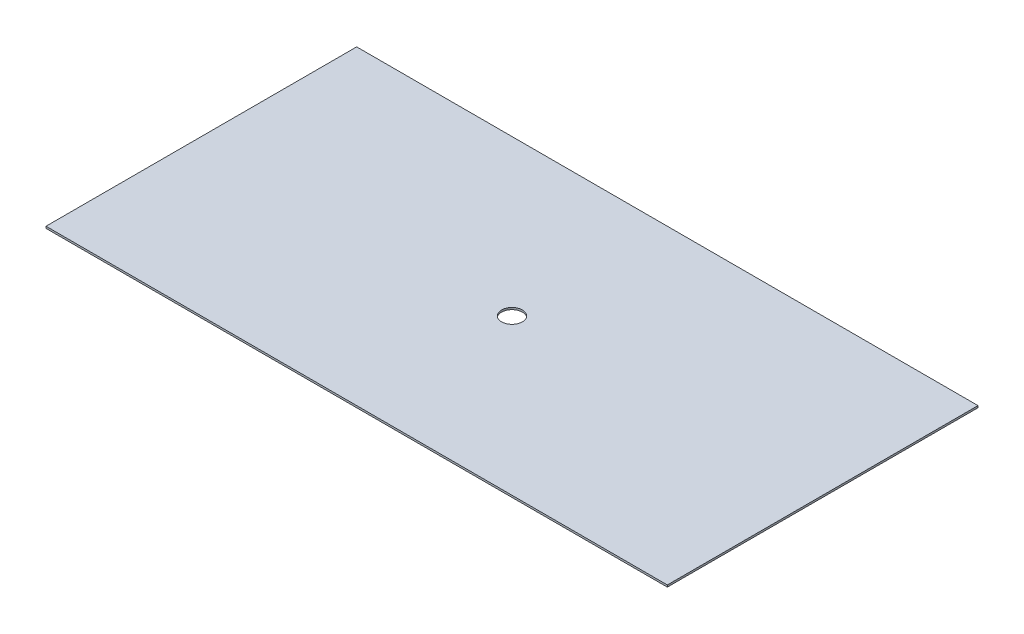
ISO-10303-21;
HEADER;
FILE_DESCRIPTION(('STEP AP214'),'2;1');
FILE_NAME('part.step','',(''),(''),'','','');
FILE_SCHEMA(('AUTOMOTIVE_DESIGN { 1 0 10303 214 1 1 1 1 }'));
ENDSEC;
DATA;
#1=APPLICATION_CONTEXT('core data for automotive mechanical design processes');
#2=APPLICATION_PROTOCOL_DEFINITION('international standard','automotive_design',2000,#1);
#3=PRODUCT_CONTEXT('',#1,'mechanical');
#4=PRODUCT('Part','Part','',(#3));
#5=PRODUCT_RELATED_PRODUCT_CATEGORY('part','',(#4));
#6=PRODUCT_DEFINITION_FORMATION('','',#4);
#7=PRODUCT_DEFINITION_CONTEXT('part definition',#1,'design');
#8=PRODUCT_DEFINITION('design','',#6,#7);
#9=PRODUCT_DEFINITION_SHAPE('','',#8);
#10=(LENGTH_UNIT() NAMED_UNIT(*) SI_UNIT(.MILLI.,.METRE.));
#11=(NAMED_UNIT(*) PLANE_ANGLE_UNIT() SI_UNIT($,.RADIAN.));
#12=(NAMED_UNIT(*) SI_UNIT($,.STERADIAN.) SOLID_ANGLE_UNIT());
#13=UNCERTAINTY_MEASURE_WITH_UNIT(LENGTH_MEASURE(1.E-05),#10,'distance_accuracy_value','');
#14=(GEOMETRIC_REPRESENTATION_CONTEXT(3) GLOBAL_UNCERTAINTY_ASSIGNED_CONTEXT((#13)) GLOBAL_UNIT_ASSIGNED_CONTEXT((#10,
#11,#12)) REPRESENTATION_CONTEXT('',''));
#15=CARTESIAN_POINT('',(0.,0.,0.));
#16=DIRECTION('',(0.,0.,1.));
#17=DIRECTION('',(1.,0.,0.));
#18=AXIS2_PLACEMENT_3D('',#15,#16,#17);
#19=CARTESIAN_POINT('',(-120.,-0.7366,-60.));
#20=DIRECTION('',(-1.,0.,0.));
#21=DIRECTION('',(0.,0.,1.));
#22=AXIS2_PLACEMENT_3D('',#19,#20,#21);
#23=PLANE('',#22);
#24=DIRECTION('',(0.,0.,1.));
#25=VECTOR('',#24,1.);
#26=CARTESIAN_POINT('',(-120.,0.,-60.));
#27=LINE('',#26,#25);
#28=CARTESIAN_POINT('',(-120.,0.,-60.));
#29=VERTEX_POINT('',#28);
#30=CARTESIAN_POINT('',(-120.,0.,60.));
#31=VERTEX_POINT('',#30);
#32=EDGE_CURVE('E100',#29,#31,#27,.T.);
#33=ORIENTED_EDGE('',*,*,#32,.F.);
#34=DIRECTION('',(0.,1.,0.));
#35=VECTOR('',#34,1.);
#36=CARTESIAN_POINT('',(-120.,-0.7366,-60.));
#37=LINE('',#36,#35);
#38=CARTESIAN_POINT('',(-120.,-0.7366,-60.));
#39=VERTEX_POINT('',#38);
#40=EDGE_CURVE('E11',#39,#29,#37,.T.);
#41=ORIENTED_EDGE('',*,*,#40,.F.);
#42=DIRECTION('',(0.,0.,1.));
#43=VECTOR('',#42,1.);
#44=CARTESIAN_POINT('',(-120.,-0.7366,-60.));
#45=LINE('',#44,#43);
#46=CARTESIAN_POINT('',(-120.,-0.7366,60.));
#47=VERTEX_POINT('',#46);
#48=EDGE_CURVE('E93',#39,#47,#45,.T.);
#49=ORIENTED_EDGE('',*,*,#48,.T.);
#50=DIRECTION('',(0.,1.,0.));
#51=VECTOR('',#50,1.);
#52=CARTESIAN_POINT('',(-120.,-0.7366,60.));
#53=LINE('',#52,#51);
#54=EDGE_CURVE('E38',#47,#31,#53,.T.);
#55=ORIENTED_EDGE('',*,*,#54,.T.);
#56=EDGE_LOOP('',(#33,#41,#49,#55));
#57=FACE_BOUND('',#56,.T.);
#58=ADVANCED_FACE('F35',(#57),#23,.T.);
#59=CARTESIAN_POINT('',(-120.,-0.7366,-60.));
#60=DIRECTION('',(0.,0.,-1.));
#61=DIRECTION('',(-1.,0.,0.));
#62=AXIS2_PLACEMENT_3D('',#59,#60,#61);
#63=PLANE('',#62);
#64=DIRECTION('',(-1.,0.,0.));
#65=VECTOR('',#64,1.);
#66=CARTESIAN_POINT('',(-120.,0.,-60.));
#67=LINE('',#66,#65);
#68=CARTESIAN_POINT('',(120.,0.,-60.));
#69=VERTEX_POINT('',#68);
#70=EDGE_CURVE('E95',#69,#29,#67,.T.);
#71=ORIENTED_EDGE('',*,*,#70,.F.);
#72=DIRECTION('',(0.,1.,0.));
#73=VECTOR('',#72,1.);
#74=CARTESIAN_POINT('',(120.,-0.7366,-60.));
#75=LINE('',#74,#73);
#76=CARTESIAN_POINT('',(120.,-0.7366,-60.));
#77=VERTEX_POINT('',#76);
#78=EDGE_CURVE('E44',#77,#69,#75,.T.);
#79=ORIENTED_EDGE('',*,*,#78,.F.);
#80=DIRECTION('',(-1.,0.,0.));
#81=VECTOR('',#80,1.);
#82=CARTESIAN_POINT('',(-120.,-0.7366,-60.));
#83=LINE('',#82,#81);
#84=EDGE_CURVE('E90',#77,#39,#83,.T.);
#85=ORIENTED_EDGE('',*,*,#84,.T.);
#86=ORIENTED_EDGE('',*,*,#40,.T.);
#87=EDGE_LOOP('',(#71,#79,#85,#86));
#88=FACE_BOUND('',#87,.T.);
#89=ADVANCED_FACE('F111',(#88),#63,.T.);
#90=CARTESIAN_POINT('',(120.,-0.7366,-60.));
#91=DIRECTION('',(1.,0.,0.));
#92=DIRECTION('',(0.,0.,-1.));
#93=AXIS2_PLACEMENT_3D('',#90,#91,#92);
#94=PLANE('',#93);
#95=DIRECTION('',(0.,0.,-1.));
#96=VECTOR('',#95,1.);
#97=CARTESIAN_POINT('',(120.,0.,-60.));
#98=LINE('',#97,#96);
#99=CARTESIAN_POINT('',(120.,0.,60.));
#100=VERTEX_POINT('',#99);
#101=EDGE_CURVE('E85',#100,#69,#98,.T.);
#102=ORIENTED_EDGE('',*,*,#101,.F.);
#103=DIRECTION('',(0.,1.,0.));
#104=VECTOR('',#103,1.);
#105=CARTESIAN_POINT('',(120.,-0.7366,60.));
#106=LINE('',#105,#104);
#107=CARTESIAN_POINT('',(120.,-0.7366,60.));
#108=VERTEX_POINT('',#107);
#109=EDGE_CURVE('E80',#108,#100,#106,.T.);
#110=ORIENTED_EDGE('',*,*,#109,.F.);
#111=DIRECTION('',(0.,0.,-1.));
#112=VECTOR('',#111,1.);
#113=CARTESIAN_POINT('',(120.,-0.7366,-60.));
#114=LINE('',#113,#112);
#115=EDGE_CURVE('E83',#108,#77,#114,.T.);
#116=ORIENTED_EDGE('',*,*,#115,.T.);
#117=ORIENTED_EDGE('',*,*,#78,.T.);
#118=EDGE_LOOP('',(#102,#110,#116,#117));
#119=FACE_BOUND('',#118,.T.);
#120=ADVANCED_FACE('F82',(#119),#94,.T.);
#121=CARTESIAN_POINT('',(-120.,-0.7366,60.));
#122=DIRECTION('',(0.,0.,1.));
#123=DIRECTION('',(1.,0.,0.));
#124=AXIS2_PLACEMENT_3D('',#121,#122,#123);
#125=PLANE('',#124);
#126=DIRECTION('',(1.,0.,0.));
#127=VECTOR('',#126,1.);
#128=CARTESIAN_POINT('',(-120.,0.,60.));
#129=LINE('',#128,#127);
#130=EDGE_CURVE('E103',#31,#100,#129,.T.);
#131=ORIENTED_EDGE('',*,*,#130,.F.);
#132=ORIENTED_EDGE('',*,*,#54,.F.);
#133=DIRECTION('',(1.,0.,0.));
#134=VECTOR('',#133,1.);
#135=CARTESIAN_POINT('',(-120.,-0.7366,60.));
#136=LINE('',#135,#134);
#137=EDGE_CURVE('E89',#47,#108,#136,.T.);
#138=ORIENTED_EDGE('',*,*,#137,.T.);
#139=ORIENTED_EDGE('',*,*,#109,.T.);
#140=EDGE_LOOP('',(#131,#132,#138,#139));
#141=FACE_BOUND('',#140,.T.);
#142=ADVANCED_FACE('F92',(#141),#125,.T.);
#143=CARTESIAN_POINT('',(0.,-0.7366,0.));
#144=DIRECTION('',(0.,1.,0.));
#145=DIRECTION('',(0.,0.,1.));
#146=AXIS2_PLACEMENT_3D('',#143,#144,#145);
#147=PLANE('',#146);
#148=CARTESIAN_POINT('',(0.,-0.7366,0.));
#149=DIRECTION('',(0.,1.,0.));
#150=DIRECTION('',(0.,0.,1.));
#151=AXIS2_PLACEMENT_3D('',#148,#149,#150);
#152=CIRCLE('',#151,4.);
#153=CARTESIAN_POINT('',(0.,-0.7366,4.));
#154=VERTEX_POINT('',#153);
#155=EDGE_CURVE('E104',#154,#154,#152,.T.);
#156=ORIENTED_EDGE('',*,*,#155,.T.);
#157=EDGE_LOOP('',(#156));
#158=FACE_BOUND('',#157,.T.);
#159=ORIENTED_EDGE('',*,*,#48,.F.);
#160=ORIENTED_EDGE('',*,*,#84,.F.);
#161=ORIENTED_EDGE('',*,*,#115,.F.);
#162=ORIENTED_EDGE('',*,*,#137,.F.);
#163=EDGE_LOOP('',(#159,#160,#161,#162));
#164=FACE_BOUND('',#163,.T.);
#165=ADVANCED_FACE('F88',(#158,#164),#147,.F.);
#166=CARTESIAN_POINT('',(0.,0.,0.));
#167=DIRECTION('',(0.,1.,0.));
#168=DIRECTION('',(0.,0.,1.));
#169=AXIS2_PLACEMENT_3D('',#166,#167,#168);
#170=PLANE('',#169);
#171=CARTESIAN_POINT('',(0.,0.,0.));
#172=DIRECTION('',(0.,1.,0.));
#173=DIRECTION('',(0.,0.,1.));
#174=AXIS2_PLACEMENT_3D('',#171,#172,#173);
#175=CIRCLE('',#174,4.);
#176=CARTESIAN_POINT('',(0.,0.,4.));
#177=VERTEX_POINT('',#176);
#178=EDGE_CURVE('E141',#177,#177,#175,.T.);
#179=ORIENTED_EDGE('',*,*,#178,.F.);
#180=EDGE_LOOP('',(#179));
#181=FACE_BOUND('',#180,.T.);
#182=ORIENTED_EDGE('',*,*,#32,.T.);
#183=ORIENTED_EDGE('',*,*,#130,.T.);
#184=ORIENTED_EDGE('',*,*,#101,.T.);
#185=ORIENTED_EDGE('',*,*,#70,.T.);
#186=EDGE_LOOP('',(#182,#183,#184,#185));
#187=FACE_BOUND('',#186,.T.);
#188=ADVANCED_FACE('F110',(#181,#187),#170,.T.);
#189=CARTESIAN_POINT('',(0.,0.,0.));
#190=DIRECTION('',(0.,1.,0.));
#191=DIRECTION('',(0.,0.,1.));
#192=AXIS2_PLACEMENT_3D('',#189,#190,#191);
#193=CYLINDRICAL_SURFACE('',#192,4.);
#194=ORIENTED_EDGE('',*,*,#155,.F.);
#195=EDGE_LOOP('',(#194));
#196=FACE_BOUND('',#195,.T.);
#197=ORIENTED_EDGE('',*,*,#178,.T.);
#198=EDGE_LOOP('',(#197));
#199=FACE_BOUND('',#198,.T.);
#200=ADVANCED_FACE('F129',(#196,#199),#193,.F.);
#201=CLOSED_SHELL('',(#58,#89,#120,#142,#165,#188,#200));
#202=MANIFOLD_SOLID_BREP('B2',#201);
#203=ADVANCED_BREP_SHAPE_REPRESENTATION('',(#18,#202),#14);
#204=SHAPE_DEFINITION_REPRESENTATION(#9,#203);
ENDSEC;
END-ISO-10303-21;
